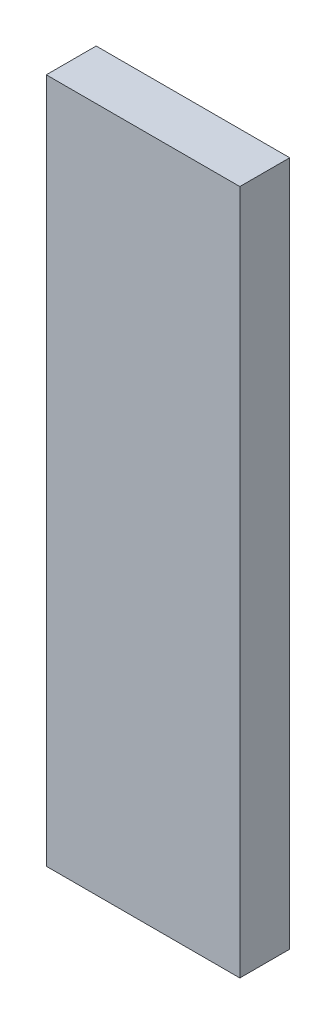
ISO-10303-21;
HEADER;
FILE_DESCRIPTION(('STEP AP214'),'2;1');
FILE_NAME('part.step','',(''),(''),'','','');
FILE_SCHEMA(('AUTOMOTIVE_DESIGN { 1 0 10303 214 1 1 1 1 }'));
ENDSEC;
DATA;
#1=APPLICATION_CONTEXT('core data for automotive mechanical design processes');
#2=APPLICATION_PROTOCOL_DEFINITION('international standard','automotive_design',2000,#1);
#3=PRODUCT_CONTEXT('',#1,'mechanical');
#4=PRODUCT('Part','Part','',(#3));
#5=PRODUCT_RELATED_PRODUCT_CATEGORY('part','',(#4));
#6=PRODUCT_DEFINITION_FORMATION('','',#4);
#7=PRODUCT_DEFINITION_CONTEXT('part definition',#1,'design');
#8=PRODUCT_DEFINITION('design','',#6,#7);
#9=PRODUCT_DEFINITION_SHAPE('','',#8);
#10=(LENGTH_UNIT() NAMED_UNIT(*) SI_UNIT(.MILLI.,.METRE.));
#11=(NAMED_UNIT(*) PLANE_ANGLE_UNIT() SI_UNIT($,.RADIAN.));
#12=(NAMED_UNIT(*) SI_UNIT($,.STERADIAN.) SOLID_ANGLE_UNIT());
#13=UNCERTAINTY_MEASURE_WITH_UNIT(LENGTH_MEASURE(1.E-05),#10,'distance_accuracy_value','');
#14=(GEOMETRIC_REPRESENTATION_CONTEXT(3) GLOBAL_UNCERTAINTY_ASSIGNED_CONTEXT((#13)) GLOBAL_UNIT_ASSIGNED_CONTEXT((#10,
#11,#12)) REPRESENTATION_CONTEXT('',''));
#15=CARTESIAN_POINT('',(0.,0.,0.));
#16=DIRECTION('',(0.,0.,1.));
#17=DIRECTION('',(1.,0.,0.));
#18=AXIS2_PLACEMENT_3D('',#15,#16,#17);
#19=CARTESIAN_POINT('',(0.,0.,0.1));
#20=DIRECTION('',(0.,0.,1.));
#21=DIRECTION('',(1.,0.,0.));
#22=AXIS2_PLACEMENT_3D('',#19,#20,#21);
#23=PLANE('',#22);
#24=DIRECTION('',(0.,1.,0.));
#25=VECTOR('',#24,1.);
#26=CARTESIAN_POINT('',(1.825,-2.812,0.1));
#27=LINE('',#26,#25);
#28=CARTESIAN_POINT('',(1.825,-1.438,0.1));
#29=VERTEX_POINT('',#28);
#30=CARTESIAN_POINT('',(1.825,-2.812,0.1));
#31=VERTEX_POINT('',#30);
#32=EDGE_CURVE('E68',#29,#31,#27,.F.);
#33=ORIENTED_EDGE('',*,*,#32,.F.);
#34=DIRECTION('',(1.,0.,0.));
#35=VECTOR('',#34,1.);
#36=CARTESIAN_POINT('',(1.825,-1.438,0.1));
#37=LINE('',#36,#35);
#38=CARTESIAN_POINT('',(1.437,-1.438,0.1));
#39=VERTEX_POINT('',#38);
#40=EDGE_CURVE('E20',#39,#29,#37,.T.);
#41=ORIENTED_EDGE('',*,*,#40,.F.);
#42=DIRECTION('',(0.,1.,0.));
#43=VECTOR('',#42,1.);
#44=CARTESIAN_POINT('',(1.437,-1.438,0.1));
#45=LINE('',#44,#43);
#46=CARTESIAN_POINT('',(1.437,-2.812,0.1));
#47=VERTEX_POINT('',#46);
#48=EDGE_CURVE('E58',#47,#39,#45,.T.);
#49=ORIENTED_EDGE('',*,*,#48,.F.);
#50=DIRECTION('',(1.,0.,0.));
#51=VECTOR('',#50,1.);
#52=CARTESIAN_POINT('',(1.437,-2.812,0.1));
#53=LINE('',#52,#51);
#54=EDGE_CURVE('E53',#31,#47,#53,.F.);
#55=ORIENTED_EDGE('',*,*,#54,.F.);
#56=EDGE_LOOP('',(#33,#41,#49,#55));
#57=FACE_BOUND('',#56,.T.);
#58=ADVANCED_FACE('F17',(#57),#23,.T.);
#59=CARTESIAN_POINT('',(1.825,-1.438,0.));
#60=DIRECTION('',(0.,1.,0.));
#61=DIRECTION('',(0.,0.,1.));
#62=AXIS2_PLACEMENT_3D('',#59,#60,#61);
#63=PLANE('',#62);
#64=DIRECTION('',(0.,0.,-1.));
#65=VECTOR('',#64,1.);
#66=CARTESIAN_POINT('',(1.825,-1.438,0.));
#67=LINE('',#66,#65);
#68=CARTESIAN_POINT('',(1.825,-1.438,0.));
#69=VERTEX_POINT('',#68);
#70=EDGE_CURVE('E79',#69,#29,#67,.F.);
#71=ORIENTED_EDGE('',*,*,#70,.F.);
#72=DIRECTION('',(1.,0.,0.));
#73=VECTOR('',#72,1.);
#74=CARTESIAN_POINT('',(0.,-1.438,0.));
#75=LINE('',#74,#73);
#76=CARTESIAN_POINT('',(1.437,-1.438,0.));
#77=VERTEX_POINT('',#76);
#78=EDGE_CURVE('E74',#69,#77,#75,.F.);
#79=ORIENTED_EDGE('',*,*,#78,.T.);
#80=DIRECTION('',(0.,0.,1.));
#81=VECTOR('',#80,1.);
#82=CARTESIAN_POINT('',(1.437,-1.438,0.));
#83=LINE('',#82,#81);
#84=EDGE_CURVE('E63',#39,#77,#83,.F.);
#85=ORIENTED_EDGE('',*,*,#84,.F.);
#86=ORIENTED_EDGE('',*,*,#40,.T.);
#87=EDGE_LOOP('',(#71,#79,#85,#86));
#88=FACE_BOUND('',#87,.T.);
#89=ADVANCED_FACE('F73',(#88),#63,.T.);
#90=CARTESIAN_POINT('',(1.437,-1.438,0.));
#91=DIRECTION('',(-1.,0.,0.));
#92=DIRECTION('',(0.,0.,1.));
#93=AXIS2_PLACEMENT_3D('',#90,#91,#92);
#94=PLANE('',#93);
#95=ORIENTED_EDGE('',*,*,#84,.T.);
#96=DIRECTION('',(0.,1.,0.));
#97=VECTOR('',#96,1.);
#98=CARTESIAN_POINT('',(1.437,0.,0.));
#99=LINE('',#98,#97);
#100=CARTESIAN_POINT('',(1.437,-2.812,0.));
#101=VERTEX_POINT('',#100);
#102=EDGE_CURVE('E84',#77,#101,#99,.F.);
#103=ORIENTED_EDGE('',*,*,#102,.T.);
#104=DIRECTION('',(0.,0.,-1.));
#105=VECTOR('',#104,1.);
#106=CARTESIAN_POINT('',(1.437,-2.812,0.));
#107=LINE('',#106,#105);
#108=EDGE_CURVE('E65',#47,#101,#107,.T.);
#109=ORIENTED_EDGE('',*,*,#108,.F.);
#110=ORIENTED_EDGE('',*,*,#48,.T.);
#111=EDGE_LOOP('',(#95,#103,#109,#110));
#112=FACE_BOUND('',#111,.T.);
#113=ADVANCED_FACE('F60',(#112),#94,.T.);
#114=CARTESIAN_POINT('',(1.437,-2.812,0.));
#115=DIRECTION('',(0.,-1.,0.));
#116=DIRECTION('',(0.,0.,-1.));
#117=AXIS2_PLACEMENT_3D('',#114,#115,#116);
#118=PLANE('',#117);
#119=ORIENTED_EDGE('',*,*,#108,.T.);
#120=DIRECTION('',(1.,0.,0.));
#121=VECTOR('',#120,1.);
#122=CARTESIAN_POINT('',(0.,-2.812,0.));
#123=LINE('',#122,#121);
#124=CARTESIAN_POINT('',(1.825,-2.812,0.));
#125=VERTEX_POINT('',#124);
#126=EDGE_CURVE('E26',#101,#125,#123,.T.);
#127=ORIENTED_EDGE('',*,*,#126,.T.);
#128=DIRECTION('',(0.,0.,-1.));
#129=VECTOR('',#128,1.);
#130=CARTESIAN_POINT('',(1.825,-2.812,0.));
#131=LINE('',#130,#129);
#132=EDGE_CURVE('E34',#31,#125,#131,.T.);
#133=ORIENTED_EDGE('',*,*,#132,.F.);
#134=ORIENTED_EDGE('',*,*,#54,.T.);
#135=EDGE_LOOP('',(#119,#127,#133,#134));
#136=FACE_BOUND('',#135,.T.);
#137=ADVANCED_FACE('F88',(#136),#118,.T.);
#138=CARTESIAN_POINT('',(1.825,-2.812,0.));
#139=DIRECTION('',(1.,0.,0.));
#140=DIRECTION('',(0.,0.,-1.));
#141=AXIS2_PLACEMENT_3D('',#138,#139,#140);
#142=PLANE('',#141);
#143=ORIENTED_EDGE('',*,*,#132,.T.);
#144=DIRECTION('',(0.,1.,0.));
#145=VECTOR('',#144,1.);
#146=CARTESIAN_POINT('',(1.825,0.,0.));
#147=LINE('',#146,#145);
#148=EDGE_CURVE('E11',#125,#69,#147,.T.);
#149=ORIENTED_EDGE('',*,*,#148,.T.);
#150=ORIENTED_EDGE('',*,*,#70,.T.);
#151=ORIENTED_EDGE('',*,*,#32,.T.);
#152=EDGE_LOOP('',(#143,#149,#150,#151));
#153=FACE_BOUND('',#152,.T.);
#154=ADVANCED_FACE('F91',(#153),#142,.T.);
#155=CARTESIAN_POINT('',(0.,0.,0.));
#156=DIRECTION('',(0.,0.,1.));
#157=DIRECTION('',(1.,0.,0.));
#158=AXIS2_PLACEMENT_3D('',#155,#156,#157);
#159=PLANE('',#158);
#160=ORIENTED_EDGE('',*,*,#126,.F.);
#161=ORIENTED_EDGE('',*,*,#102,.F.);
#162=ORIENTED_EDGE('',*,*,#78,.F.);
#163=ORIENTED_EDGE('',*,*,#148,.F.);
#164=EDGE_LOOP('',(#160,#161,#162,#163));
#165=FACE_BOUND('',#164,.T.);
#166=ADVANCED_FACE('F90',(#165),#159,.F.);
#167=CLOSED_SHELL('',(#58,#89,#113,#137,#154,#166));
#168=MANIFOLD_SOLID_BREP('B1',#167);
#169=ADVANCED_BREP_SHAPE_REPRESENTATION('',(#18,#168),#14);
#170=SHAPE_DEFINITION_REPRESENTATION(#9,#169);
ENDSEC;
END-ISO-10303-21;
